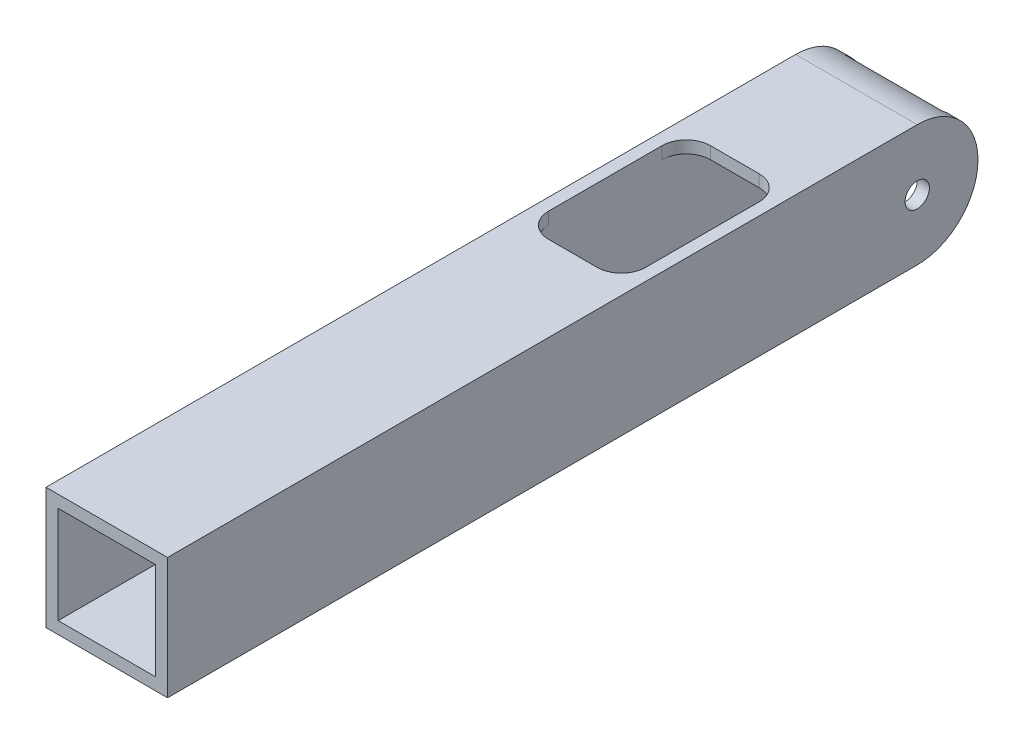
ISO-10303-21;
HEADER;
FILE_DESCRIPTION(('STEP AP214'),'2;1');
FILE_NAME('part.step','',(''),(''),'','','');
FILE_SCHEMA(('AUTOMOTIVE_DESIGN { 1 0 10303 214 1 1 1 1 }'));
ENDSEC;
DATA;
#1=APPLICATION_CONTEXT('core data for automotive mechanical design processes');
#2=APPLICATION_PROTOCOL_DEFINITION('international standard','automotive_design',2000,#1);
#3=PRODUCT_CONTEXT('',#1,'mechanical');
#4=PRODUCT('Part','Part','',(#3));
#5=PRODUCT_RELATED_PRODUCT_CATEGORY('part','',(#4));
#6=PRODUCT_DEFINITION_FORMATION('','',#4);
#7=PRODUCT_DEFINITION_CONTEXT('part definition',#1,'design');
#8=PRODUCT_DEFINITION('design','',#6,#7);
#9=PRODUCT_DEFINITION_SHAPE('','',#8);
#10=(LENGTH_UNIT() NAMED_UNIT(*) SI_UNIT(.MILLI.,.METRE.));
#11=(NAMED_UNIT(*) PLANE_ANGLE_UNIT() SI_UNIT($,.RADIAN.));
#12=(NAMED_UNIT(*) SI_UNIT($,.STERADIAN.) SOLID_ANGLE_UNIT());
#13=UNCERTAINTY_MEASURE_WITH_UNIT(LENGTH_MEASURE(1.E-05),#10,'distance_accuracy_value','');
#14=(GEOMETRIC_REPRESENTATION_CONTEXT(3) GLOBAL_UNCERTAINTY_ASSIGNED_CONTEXT((#13)) GLOBAL_UNIT_ASSIGNED_CONTEXT((#10,
#11,#12)) REPRESENTATION_CONTEXT('',''));
#15=CARTESIAN_POINT('',(0.,0.,0.));
#16=DIRECTION('',(0.,0.,1.));
#17=DIRECTION('',(1.,0.,0.));
#18=AXIS2_PLACEMENT_3D('',#15,#16,#17);
#19=CARTESIAN_POINT('',(-6.,6.00000000000001,0.));
#20=DIRECTION('',(0.,1.,0.));
#21=DIRECTION('',(0.,0.,1.));
#22=AXIS2_PLACEMENT_3D('',#19,#20,#21);
#23=PLANE('',#22);
#24=DIRECTION('',(0.,0.,1.));
#25=VECTOR('',#24,1.);
#26=CARTESIAN_POINT('',(6.,6.00000000000001,0.));
#27=LINE('',#26,#25);
#28=CARTESIAN_POINT('',(6.,6.00000000000001,3.00000000000001));
#29=VERTEX_POINT('',#28);
#30=CARTESIAN_POINT('',(6.,6.00000000000001,25.5));
#31=VERTEX_POINT('',#30);
#32=EDGE_CURVE('E167',#29,#31,#27,.T.);
#33=ORIENTED_EDGE('',*,*,#32,.T.);
#34=CARTESIAN_POINT('',(3.,6.00000000000001,25.5));
#35=DIRECTION('',(0.,1.,0.));
#36=DIRECTION('',(0.,0.,1.));
#37=AXIS2_PLACEMENT_3D('',#34,#35,#36);
#38=CIRCLE('',#37,3.);
#39=CARTESIAN_POINT('',(3.,6.00000000000001,22.5));
#40=VERTEX_POINT('',#39);
#41=EDGE_CURVE('E276',#31,#40,#38,.T.);
#42=ORIENTED_EDGE('',*,*,#41,.T.);
#43=DIRECTION('',(-1.,0.,0.));
#44=VECTOR('',#43,1.);
#45=CARTESIAN_POINT('',(-6.,6.00000000000001,22.5));
#46=LINE('',#45,#44);
#47=CARTESIAN_POINT('',(-3.,6.00000000000001,22.5));
#48=VERTEX_POINT('',#47);
#49=EDGE_CURVE('E252',#40,#48,#46,.T.);
#50=ORIENTED_EDGE('',*,*,#49,.T.);
#51=CARTESIAN_POINT('',(-3.,6.00000000000001,25.5));
#52=DIRECTION('',(0.,1.,0.));
#53=DIRECTION('',(0.,0.,1.));
#54=AXIS2_PLACEMENT_3D('',#51,#52,#53);
#55=CIRCLE('',#54,3.);
#56=CARTESIAN_POINT('',(-6.,6.00000000000001,25.5));
#57=VERTEX_POINT('',#56);
#58=EDGE_CURVE('E280',#48,#57,#55,.T.);
#59=ORIENTED_EDGE('',*,*,#58,.T.);
#60=DIRECTION('',(0.,0.,1.));
#61=VECTOR('',#60,1.);
#62=CARTESIAN_POINT('',(-6.,6.00000000000001,0.));
#63=LINE('',#62,#61);
#64=CARTESIAN_POINT('',(-6.,6.00000000000001,3.00000000000001));
#65=VERTEX_POINT('',#64);
#66=EDGE_CURVE('E166',#65,#57,#63,.T.);
#67=ORIENTED_EDGE('',*,*,#66,.F.);
#68=DIRECTION('',(1.,0.,0.));
#69=VECTOR('',#68,1.);
#70=CARTESIAN_POINT('',(-6.,6.00000000000001,3.00000000000001));
#71=LINE('',#70,#69);
#72=EDGE_CURVE('E237',#65,#29,#71,.T.);
#73=ORIENTED_EDGE('',*,*,#72,.T.);
#74=EDGE_LOOP('',(#33,#42,#50,#59,#67,#73));
#75=FACE_BOUND('',#74,.T.);
#76=ADVANCED_FACE('F31',(#75),#23,.F.);
#77=CARTESIAN_POINT('',(7.5,-7.49999999999999,100.));
#78=DIRECTION('',(-1.,0.,0.));
#79=DIRECTION('',(0.,0.,1.));
#80=AXIS2_PLACEMENT_3D('',#77,#78,#79);
#81=PLANE('',#80);
#82=CARTESIAN_POINT('',(7.5,0.,7.50000000000001));
#83=DIRECTION('',(1.,0.,0.));
#84=DIRECTION('',(0.,0.,-1.));
#85=AXIS2_PLACEMENT_3D('',#82,#83,#84);
#86=CIRCLE('',#85,1.5);
#87=CARTESIAN_POINT('',(7.5,0.,6.00000000000001));
#88=VERTEX_POINT('',#87);
#89=EDGE_CURVE('E313',#88,#88,#86,.T.);
#90=ORIENTED_EDGE('',*,*,#89,.F.);
#91=EDGE_LOOP('',(#90));
#92=FACE_BOUND('',#91,.T.);
#93=DIRECTION('',(0.,0.,-1.));
#94=VECTOR('',#93,1.);
#95=CARTESIAN_POINT('',(7.5,-7.49999999999999,100.));
#96=LINE('',#95,#94);
#97=CARTESIAN_POINT('',(7.5,-7.49999999999999,100.));
#98=VERTEX_POINT('',#97);
#99=CARTESIAN_POINT('',(7.5,-7.49999999999999,7.50000000000001));
#100=VERTEX_POINT('',#99);
#101=EDGE_CURVE('E201',#98,#100,#96,.T.);
#102=ORIENTED_EDGE('',*,*,#101,.T.);
#103=CARTESIAN_POINT('',(7.5,0.,7.50000000000001));
#104=DIRECTION('',(-1.,0.,0.));
#105=DIRECTION('',(0.,0.,1.));
#106=AXIS2_PLACEMENT_3D('',#103,#104,#105);
#107=CIRCLE('',#106,7.5);
#108=CARTESIAN_POINT('',(7.5,0.,0.));
#109=VERTEX_POINT('',#108);
#110=EDGE_CURVE('E218',#100,#109,#107,.F.);
#111=ORIENTED_EDGE('',*,*,#110,.T.);
#112=CARTESIAN_POINT('',(7.5,0.,7.50000000000001));
#113=DIRECTION('',(-1.,0.,0.));
#114=DIRECTION('',(0.,0.,1.));
#115=AXIS2_PLACEMENT_3D('',#112,#113,#114);
#116=CIRCLE('',#115,7.5);
#117=CARTESIAN_POINT('',(7.5,7.50000000000001,7.50000000000001));
#118=VERTEX_POINT('',#117);
#119=EDGE_CURVE('E216',#109,#118,#116,.F.);
#120=ORIENTED_EDGE('',*,*,#119,.T.);
#121=DIRECTION('',(0.,0.,-1.));
#122=VECTOR('',#121,1.);
#123=CARTESIAN_POINT('',(7.5,7.50000000000001,100.));
#124=LINE('',#123,#122);
#125=CARTESIAN_POINT('',(7.5,7.50000000000001,100.));
#126=VERTEX_POINT('',#125);
#127=EDGE_CURVE('E210',#126,#118,#124,.T.);
#128=ORIENTED_EDGE('',*,*,#127,.F.);
#129=DIRECTION('',(0.,1.,0.));
#130=VECTOR('',#129,1.);
#131=CARTESIAN_POINT('',(7.5,-7.49999999999999,100.));
#132=LINE('',#131,#130);
#133=EDGE_CURVE('E189',#98,#126,#132,.T.);
#134=ORIENTED_EDGE('',*,*,#133,.F.);
#135=EDGE_LOOP('',(#102,#111,#120,#128,#134));
#136=FACE_BOUND('',#135,.T.);
#137=ADVANCED_FACE('F362',(#92,#136),#81,.F.);
#138=CARTESIAN_POINT('',(-7.5,7.50000000000001,100.));
#139=DIRECTION('',(0.,-1.,0.));
#140=DIRECTION('',(0.,0.,-1.));
#141=AXIS2_PLACEMENT_3D('',#138,#139,#140);
#142=PLANE('',#141);
#143=DIRECTION('',(1.,0.,0.));
#144=VECTOR('',#143,1.);
#145=CARTESIAN_POINT('',(6.00000000000001,7.50000000000001,42.5));
#146=LINE('',#145,#144);
#147=CARTESIAN_POINT('',(-3.,7.50000000000001,42.5));
#148=VERTEX_POINT('',#147);
#149=CARTESIAN_POINT('',(3.,7.50000000000001,42.5));
#150=VERTEX_POINT('',#149);
#151=EDGE_CURVE('E292',#148,#150,#146,.T.);
#152=ORIENTED_EDGE('',*,*,#151,.F.);
#153=CARTESIAN_POINT('',(-3.,7.50000000000001,39.5));
#154=DIRECTION('',(0.,-1.,0.));
#155=DIRECTION('',(0.,0.,-1.));
#156=AXIS2_PLACEMENT_3D('',#153,#154,#155);
#157=CIRCLE('',#156,3.);
#158=CARTESIAN_POINT('',(-5.99999999999999,7.50000000000001,39.5));
#159=VERTEX_POINT('',#158);
#160=EDGE_CURVE('E39',#148,#159,#157,.T.);
#161=ORIENTED_EDGE('',*,*,#160,.T.);
#162=DIRECTION('',(0.,0.,1.));
#163=VECTOR('',#162,1.);
#164=CARTESIAN_POINT('',(-5.99999999999999,7.50000000000001,42.5));
#165=LINE('',#164,#163);
#166=CARTESIAN_POINT('',(-5.99999999999999,7.50000000000001,25.5));
#167=VERTEX_POINT('',#166);
#168=EDGE_CURVE('E291',#167,#159,#165,.T.);
#169=ORIENTED_EDGE('',*,*,#168,.F.);
#170=CARTESIAN_POINT('',(-3.,7.50000000000001,25.5));
#171=DIRECTION('',(0.,-1.,0.));
#172=DIRECTION('',(0.,0.,-1.));
#173=AXIS2_PLACEMENT_3D('',#170,#171,#172);
#174=CIRCLE('',#173,3.);
#175=CARTESIAN_POINT('',(-3.00000000000001,7.50000000000001,22.5));
#176=VERTEX_POINT('',#175);
#177=EDGE_CURVE('E278',#167,#176,#174,.T.);
#178=ORIENTED_EDGE('',*,*,#177,.T.);
#179=DIRECTION('',(-1.,0.,0.));
#180=VECTOR('',#179,1.);
#181=CARTESIAN_POINT('',(6.00000000000001,7.50000000000001,22.5));
#182=LINE('',#181,#180);
#183=CARTESIAN_POINT('',(3.,7.50000000000001,22.5));
#184=VERTEX_POINT('',#183);
#185=EDGE_CURVE('E310',#184,#176,#182,.T.);
#186=ORIENTED_EDGE('',*,*,#185,.F.);
#187=CARTESIAN_POINT('',(3.,7.50000000000001,25.5));
#188=DIRECTION('',(0.,-1.,0.));
#189=DIRECTION('',(0.,0.,-1.));
#190=AXIS2_PLACEMENT_3D('',#187,#188,#189);
#191=CIRCLE('',#190,3.);
#192=CARTESIAN_POINT('',(6.00000000000001,7.50000000000001,25.5));
#193=VERTEX_POINT('',#192);
#194=EDGE_CURVE('E274',#184,#193,#191,.T.);
#195=ORIENTED_EDGE('',*,*,#194,.T.);
#196=DIRECTION('',(0.,0.,-1.));
#197=VECTOR('',#196,1.);
#198=CARTESIAN_POINT('',(6.00000000000001,7.50000000000001,42.5));
#199=LINE('',#198,#197);
#200=CARTESIAN_POINT('',(6.00000000000001,7.50000000000001,39.5));
#201=VERTEX_POINT('',#200);
#202=EDGE_CURVE('E307',#201,#193,#199,.T.);
#203=ORIENTED_EDGE('',*,*,#202,.F.);
#204=CARTESIAN_POINT('',(3.,7.50000000000001,39.5));
#205=DIRECTION('',(0.,-1.,0.));
#206=DIRECTION('',(0.,0.,-1.));
#207=AXIS2_PLACEMENT_3D('',#204,#205,#206);
#208=CIRCLE('',#207,3.);
#209=EDGE_CURVE('E283',#201,#150,#208,.T.);
#210=ORIENTED_EDGE('',*,*,#209,.T.);
#211=EDGE_LOOP('',(#152,#161,#169,#178,#186,#195,#203,#210));
#212=FACE_BOUND('',#211,.T.);
#213=ORIENTED_EDGE('',*,*,#127,.T.);
#214=DIRECTION('',(-1.,0.,0.));
#215=VECTOR('',#214,1.);
#216=CARTESIAN_POINT('',(-7.5,7.50000000000001,7.50000000000001));
#217=LINE('',#216,#215);
#218=CARTESIAN_POINT('',(-7.5,7.50000000000001,7.50000000000001));
#219=VERTEX_POINT('',#218);
#220=EDGE_CURVE('E235',#118,#219,#217,.T.);
#221=ORIENTED_EDGE('',*,*,#220,.T.);
#222=DIRECTION('',(0.,0.,-1.));
#223=VECTOR('',#222,1.);
#224=CARTESIAN_POINT('',(-7.5,7.50000000000001,100.));
#225=LINE('',#224,#223);
#226=CARTESIAN_POINT('',(-7.5,7.50000000000001,100.));
#227=VERTEX_POINT('',#226);
#228=EDGE_CURVE('E207',#227,#219,#225,.T.);
#229=ORIENTED_EDGE('',*,*,#228,.F.);
#230=DIRECTION('',(-1.,0.,0.));
#231=VECTOR('',#230,1.);
#232=CARTESIAN_POINT('',(-7.5,7.50000000000001,100.));
#233=LINE('',#232,#231);
#234=EDGE_CURVE('E195',#126,#227,#233,.T.);
#235=ORIENTED_EDGE('',*,*,#234,.F.);
#236=EDGE_LOOP('',(#213,#221,#229,#235));
#237=FACE_BOUND('',#236,.T.);
#238=ADVANCED_FACE('F289',(#212,#237),#142,.F.);
#239=CARTESIAN_POINT('',(-7.5,-7.49999999999999,100.));
#240=DIRECTION('',(1.,0.,0.));
#241=DIRECTION('',(0.,0.,-1.));
#242=AXIS2_PLACEMENT_3D('',#239,#240,#241);
#243=PLANE('',#242);
#244=CARTESIAN_POINT('',(-7.5,0.,7.50000000000001));
#245=DIRECTION('',(1.,0.,0.));
#246=DIRECTION('',(0.,0.,-1.));
#247=AXIS2_PLACEMENT_3D('',#244,#245,#246);
#248=CIRCLE('',#247,1.5);
#249=CARTESIAN_POINT('',(-7.5,0.,6.00000000000001));
#250=VERTEX_POINT('',#249);
#251=EDGE_CURVE('E250',#250,#250,#248,.T.);
#252=ORIENTED_EDGE('',*,*,#251,.T.);
#253=EDGE_LOOP('',(#252));
#254=FACE_BOUND('',#253,.T.);
#255=CARTESIAN_POINT('',(-7.5,0.,7.50000000000001));
#256=DIRECTION('',(1.,0.,0.));
#257=DIRECTION('',(0.,0.,-1.));
#258=AXIS2_PLACEMENT_3D('',#255,#256,#257);
#259=CIRCLE('',#258,7.5);
#260=CARTESIAN_POINT('',(-7.5,0.,0.));
#261=VERTEX_POINT('',#260);
#262=EDGE_CURVE('E231',#219,#261,#259,.F.);
#263=ORIENTED_EDGE('',*,*,#262,.T.);
#264=CARTESIAN_POINT('',(-7.5,0.,7.50000000000001));
#265=DIRECTION('',(1.,0.,0.));
#266=DIRECTION('',(0.,0.,-1.));
#267=AXIS2_PLACEMENT_3D('',#264,#265,#266);
#268=CIRCLE('',#267,7.5);
#269=CARTESIAN_POINT('',(-7.5,-7.49999999999999,7.50000000000001));
#270=VERTEX_POINT('',#269);
#271=EDGE_CURVE('E233',#261,#270,#268,.F.);
#272=ORIENTED_EDGE('',*,*,#271,.T.);
#273=DIRECTION('',(0.,0.,-1.));
#274=VECTOR('',#273,1.);
#275=CARTESIAN_POINT('',(-7.5,-7.49999999999999,100.));
#276=LINE('',#275,#274);
#277=CARTESIAN_POINT('',(-7.5,-7.49999999999999,100.));
#278=VERTEX_POINT('',#277);
#279=EDGE_CURVE('E204',#278,#270,#276,.T.);
#280=ORIENTED_EDGE('',*,*,#279,.F.);
#281=DIRECTION('',(0.,-1.,0.));
#282=VECTOR('',#281,1.);
#283=CARTESIAN_POINT('',(-7.5,-7.49999999999999,100.));
#284=LINE('',#283,#282);
#285=EDGE_CURVE('E197',#227,#278,#284,.T.);
#286=ORIENTED_EDGE('',*,*,#285,.F.);
#287=ORIENTED_EDGE('',*,*,#228,.T.);
#288=EDGE_LOOP('',(#263,#272,#280,#286,#287));
#289=FACE_BOUND('',#288,.T.);
#290=ADVANCED_FACE('F367',(#254,#289),#243,.F.);
#291=CARTESIAN_POINT('',(-7.5,-7.49999999999999,100.));
#292=DIRECTION('',(0.,1.,0.));
#293=DIRECTION('',(0.,0.,1.));
#294=AXIS2_PLACEMENT_3D('',#291,#292,#293);
#295=PLANE('',#294);
#296=ORIENTED_EDGE('',*,*,#279,.T.);
#297=DIRECTION('',(1.,0.,0.));
#298=VECTOR('',#297,1.);
#299=CARTESIAN_POINT('',(7.5,-7.49999999999999,7.50000000000001));
#300=LINE('',#299,#298);
#301=EDGE_CURVE('E213',#270,#100,#300,.T.);
#302=ORIENTED_EDGE('',*,*,#301,.T.);
#303=ORIENTED_EDGE('',*,*,#101,.F.);
#304=DIRECTION('',(1.,0.,0.));
#305=VECTOR('',#304,1.);
#306=CARTESIAN_POINT('',(-7.5,-7.49999999999999,100.));
#307=LINE('',#306,#305);
#308=EDGE_CURVE('E199',#278,#98,#307,.T.);
#309=ORIENTED_EDGE('',*,*,#308,.F.);
#310=EDGE_LOOP('',(#296,#302,#303,#309));
#311=FACE_BOUND('',#310,.T.);
#312=ADVANCED_FACE('F358',(#311),#295,.F.);
#313=CARTESIAN_POINT('',(7.5,7.50000000000001,100.));
#314=DIRECTION('',(0.,0.,-1.));
#315=DIRECTION('',(-1.,0.,0.));
#316=AXIS2_PLACEMENT_3D('',#313,#314,#315);
#317=PLANE('',#316);
#318=DIRECTION('',(-1.,0.,0.));
#319=VECTOR('',#318,1.);
#320=CARTESIAN_POINT('',(-6.,6.00000000000001,100.));
#321=LINE('',#320,#319);
#322=CARTESIAN_POINT('',(6.,6.00000000000001,100.));
#323=VERTEX_POINT('',#322);
#324=CARTESIAN_POINT('',(-6.,6.00000000000001,100.));
#325=VERTEX_POINT('',#324);
#326=EDGE_CURVE('E170',#323,#325,#321,.T.);
#327=ORIENTED_EDGE('',*,*,#326,.F.);
#328=DIRECTION('',(0.,1.,0.));
#329=VECTOR('',#328,1.);
#330=CARTESIAN_POINT('',(6.,-6.00000000000001,100.));
#331=LINE('',#330,#329);
#332=CARTESIAN_POINT('',(6.,-6.00000000000001,100.));
#333=VERTEX_POINT('',#332);
#334=EDGE_CURVE('E177',#333,#323,#331,.T.);
#335=ORIENTED_EDGE('',*,*,#334,.F.);
#336=DIRECTION('',(1.,0.,0.));
#337=VECTOR('',#336,1.);
#338=CARTESIAN_POINT('',(-6.,-6.00000000000001,100.));
#339=LINE('',#338,#337);
#340=CARTESIAN_POINT('',(-6.,-6.00000000000001,100.));
#341=VERTEX_POINT('',#340);
#342=EDGE_CURVE('E182',#341,#333,#339,.T.);
#343=ORIENTED_EDGE('',*,*,#342,.F.);
#344=DIRECTION('',(0.,-1.,0.));
#345=VECTOR('',#344,1.);
#346=CARTESIAN_POINT('',(-6.,-6.00000000000001,100.));
#347=LINE('',#346,#345);
#348=EDGE_CURVE('E161',#325,#341,#347,.T.);
#349=ORIENTED_EDGE('',*,*,#348,.F.);
#350=EDGE_LOOP('',(#327,#335,#343,#349));
#351=FACE_BOUND('',#350,.T.);
#352=ORIENTED_EDGE('',*,*,#133,.T.);
#353=ORIENTED_EDGE('',*,*,#234,.T.);
#354=ORIENTED_EDGE('',*,*,#285,.T.);
#355=ORIENTED_EDGE('',*,*,#308,.T.);
#356=EDGE_LOOP('',(#352,#353,#354,#355));
#357=FACE_BOUND('',#356,.T.);
#358=ADVANCED_FACE('F179',(#351,#357),#317,.F.);
#359=CARTESIAN_POINT('',(6.,-6.00000000000001,0.));
#360=DIRECTION('',(1.,0.,0.));
#361=DIRECTION('',(0.,0.,-1.));
#362=AXIS2_PLACEMENT_3D('',#359,#360,#361);
#363=PLANE('',#362);
#364=ORIENTED_EDGE('',*,*,#202,.T.);
#365=DIRECTION('',(0.,1.,0.));
#366=VECTOR('',#365,1.);
#367=CARTESIAN_POINT('',(6.,6.00000000000001,25.5));
#368=LINE('',#367,#366);
#369=EDGE_CURVE('E263',#193,#31,#368,.F.);
#370=ORIENTED_EDGE('',*,*,#369,.T.);
#371=ORIENTED_EDGE('',*,*,#32,.F.);
#372=CARTESIAN_POINT('',(6.,0.,7.50000000000001));
#373=DIRECTION('',(1.,0.,0.));
#374=DIRECTION('',(0.,0.,-1.));
#375=AXIS2_PLACEMENT_3D('',#372,#373,#374);
#376=CIRCLE('',#375,7.5);
#377=CARTESIAN_POINT('',(6.,0.,0.));
#378=VERTEX_POINT('',#377);
#379=EDGE_CURVE('E220',#29,#378,#376,.F.);
#380=ORIENTED_EDGE('',*,*,#379,.T.);
#381=CARTESIAN_POINT('',(6.,0.,7.50000000000001));
#382=DIRECTION('',(1.,0.,0.));
#383=DIRECTION('',(0.,0.,-1.));
#384=AXIS2_PLACEMENT_3D('',#381,#382,#383);
#385=CIRCLE('',#384,7.5);
#386=CARTESIAN_POINT('',(6.,-6.00000000000001,3.00000000000002));
#387=VERTEX_POINT('',#386);
#388=EDGE_CURVE('E222',#378,#387,#385,.F.);
#389=ORIENTED_EDGE('',*,*,#388,.T.);
#390=DIRECTION('',(0.,0.,1.));
#391=VECTOR('',#390,1.);
#392=CARTESIAN_POINT('',(6.,-6.00000000000001,0.));
#393=LINE('',#392,#391);
#394=EDGE_CURVE('E187',#387,#333,#393,.T.);
#395=ORIENTED_EDGE('',*,*,#394,.T.);
#396=ORIENTED_EDGE('',*,*,#334,.T.);
#397=CARTESIAN_POINT('',(6.,6.00000000000001,39.5));
#398=VERTEX_POINT('',#397);
#399=EDGE_CURVE('E173',#398,#323,#27,.T.);
#400=ORIENTED_EDGE('',*,*,#399,.F.);
#401=DIRECTION('',(0.,1.,0.));
#402=VECTOR('',#401,1.);
#403=CARTESIAN_POINT('',(6.,7.50000000000001,39.5));
#404=LINE('',#403,#402);
#405=EDGE_CURVE('E260',#398,#201,#404,.T.);
#406=ORIENTED_EDGE('',*,*,#405,.T.);
#407=EDGE_LOOP('',(#364,#370,#371,#380,#389,#395,#396,#400,#406));
#408=FACE_BOUND('',#407,.T.);
#409=CARTESIAN_POINT('',(6.,0.,7.50000000000001));
#410=DIRECTION('',(1.,0.,0.));
#411=DIRECTION('',(0.,0.,-1.));
#412=AXIS2_PLACEMENT_3D('',#409,#410,#411);
#413=CIRCLE('',#412,1.5);
#414=CARTESIAN_POINT('',(6.,0.,6.00000000000001));
#415=VERTEX_POINT('',#414);
#416=EDGE_CURVE('E244',#415,#415,#413,.T.);
#417=ORIENTED_EDGE('',*,*,#416,.T.);
#418=EDGE_LOOP('',(#417));
#419=FACE_BOUND('',#418,.T.);
#420=ADVANCED_FACE('F305',(#408,#419),#363,.F.);
#421=CARTESIAN_POINT('',(-6.,-6.00000000000001,0.));
#422=DIRECTION('',(0.,-1.,0.));
#423=DIRECTION('',(0.,0.,-1.));
#424=AXIS2_PLACEMENT_3D('',#421,#422,#423);
#425=PLANE('',#424);
#426=ORIENTED_EDGE('',*,*,#394,.F.);
#427=DIRECTION('',(-1.,0.,0.));
#428=VECTOR('',#427,1.);
#429=CARTESIAN_POINT('',(6.,-6.00000000000001,3.00000000000002));
#430=LINE('',#429,#428);
#431=CARTESIAN_POINT('',(-6.,-6.,3.00000000000002));
#432=VERTEX_POINT('',#431);
#433=EDGE_CURVE('E225',#387,#432,#430,.T.);
#434=ORIENTED_EDGE('',*,*,#433,.T.);
#435=DIRECTION('',(0.,0.,1.));
#436=VECTOR('',#435,1.);
#437=CARTESIAN_POINT('',(-6.,-6.00000000000001,0.));
#438=LINE('',#437,#436);
#439=EDGE_CURVE('E190',#432,#341,#438,.T.);
#440=ORIENTED_EDGE('',*,*,#439,.T.);
#441=ORIENTED_EDGE('',*,*,#342,.T.);
#442=EDGE_LOOP('',(#426,#434,#440,#441));
#443=FACE_BOUND('',#442,.T.);
#444=ADVANCED_FACE('F325',(#443),#425,.F.);
#445=CARTESIAN_POINT('',(-6.,-6.00000000000001,0.));
#446=DIRECTION('',(-1.,0.,0.));
#447=DIRECTION('',(0.,0.,1.));
#448=AXIS2_PLACEMENT_3D('',#445,#446,#447);
#449=PLANE('',#448);
#450=ORIENTED_EDGE('',*,*,#66,.T.);
#451=DIRECTION('',(0.,1.,0.));
#452=VECTOR('',#451,1.);
#453=CARTESIAN_POINT('',(-6.,7.50000000000001,25.5));
#454=LINE('',#453,#452);
#455=EDGE_CURVE('E267',#57,#167,#454,.T.);
#456=ORIENTED_EDGE('',*,*,#455,.T.);
#457=ORIENTED_EDGE('',*,*,#168,.T.);
#458=DIRECTION('',(0.,1.,0.));
#459=VECTOR('',#458,1.);
#460=CARTESIAN_POINT('',(-6.,6.00000000000001,39.5));
#461=LINE('',#460,#459);
#462=CARTESIAN_POINT('',(-6.,6.00000000000001,39.5));
#463=VERTEX_POINT('',#462);
#464=EDGE_CURVE('E165',#159,#463,#461,.F.);
#465=ORIENTED_EDGE('',*,*,#464,.T.);
#466=EDGE_CURVE('E155',#463,#325,#63,.T.);
#467=ORIENTED_EDGE('',*,*,#466,.T.);
#468=ORIENTED_EDGE('',*,*,#348,.T.);
#469=ORIENTED_EDGE('',*,*,#439,.F.);
#470=CARTESIAN_POINT('',(-6.,0.,7.50000000000001));
#471=DIRECTION('',(-1.,0.,0.));
#472=DIRECTION('',(0.,0.,1.));
#473=AXIS2_PLACEMENT_3D('',#470,#471,#472);
#474=CIRCLE('',#473,7.5);
#475=CARTESIAN_POINT('',(-6.,0.,0.));
#476=VERTEX_POINT('',#475);
#477=EDGE_CURVE('E229',#432,#476,#474,.F.);
#478=ORIENTED_EDGE('',*,*,#477,.T.);
#479=CARTESIAN_POINT('',(-6.,0.,7.50000000000001));
#480=DIRECTION('',(-1.,0.,0.));
#481=DIRECTION('',(0.,0.,1.));
#482=AXIS2_PLACEMENT_3D('',#479,#480,#481);
#483=CIRCLE('',#482,7.5);
#484=EDGE_CURVE('E227',#476,#65,#483,.F.);
#485=ORIENTED_EDGE('',*,*,#484,.T.);
#486=EDGE_LOOP('',(#450,#456,#457,#465,#467,#468,#469,#478,#485));
#487=FACE_BOUND('',#486,.T.);
#488=CARTESIAN_POINT('',(-6.,0.,7.50000000000001));
#489=DIRECTION('',(-1.,0.,0.));
#490=DIRECTION('',(0.,0.,1.));
#491=AXIS2_PLACEMENT_3D('',#488,#489,#490);
#492=CIRCLE('',#491,1.5);
#493=CARTESIAN_POINT('',(-6.,0.,9.00000000000001));
#494=VERTEX_POINT('',#493);
#495=EDGE_CURVE('E247',#494,#494,#492,.T.);
#496=ORIENTED_EDGE('',*,*,#495,.T.);
#497=EDGE_LOOP('',(#496));
#498=FACE_BOUND('',#497,.T.);
#499=ADVANCED_FACE('F157',(#487,#498),#449,.F.);
#500=ORIENTED_EDGE('',*,*,#466,.F.);
#501=CARTESIAN_POINT('',(-3.,6.00000000000001,39.5));
#502=DIRECTION('',(0.,1.,0.));
#503=DIRECTION('',(0.,0.,1.));
#504=AXIS2_PLACEMENT_3D('',#501,#502,#503);
#505=CIRCLE('',#504,3.);
#506=CARTESIAN_POINT('',(-3.,6.00000000000001,42.5));
#507=VERTEX_POINT('',#506);
#508=EDGE_CURVE('E11',#463,#507,#505,.T.);
#509=ORIENTED_EDGE('',*,*,#508,.T.);
#510=DIRECTION('',(1.,0.,0.));
#511=VECTOR('',#510,1.);
#512=CARTESIAN_POINT('',(-6.,6.00000000000001,42.5));
#513=LINE('',#512,#511);
#514=CARTESIAN_POINT('',(3.,6.00000000000001,42.5));
#515=VERTEX_POINT('',#514);
#516=EDGE_CURVE('E239',#507,#515,#513,.T.);
#517=ORIENTED_EDGE('',*,*,#516,.T.);
#518=CARTESIAN_POINT('',(3.,6.00000000000001,39.5));
#519=DIRECTION('',(0.,1.,0.));
#520=DIRECTION('',(0.,0.,1.));
#521=AXIS2_PLACEMENT_3D('',#518,#519,#520);
#522=CIRCLE('',#521,3.);
#523=EDGE_CURVE('E285',#515,#398,#522,.T.);
#524=ORIENTED_EDGE('',*,*,#523,.T.);
#525=ORIENTED_EDGE('',*,*,#399,.T.);
#526=ORIENTED_EDGE('',*,*,#326,.T.);
#527=EDGE_LOOP('',(#500,#509,#517,#524,#525,#526));
#528=FACE_BOUND('',#527,.T.);
#529=ADVANCED_FACE('F171',(#528),#23,.F.);
#530=CARTESIAN_POINT('',(-7.5,0.,7.50000000000001));
#531=DIRECTION('',(1.,0.,0.));
#532=DIRECTION('',(0.,0.,-1.));
#533=AXIS2_PLACEMENT_3D('',#530,#531,#532);
#534=CYLINDRICAL_SURFACE('',#533,7.5);
#535=DIRECTION('',(-1.,0.,0.));
#536=VECTOR('',#535,1.);
#537=CARTESIAN_POINT('',(7.5,0.,0.));
#538=LINE('',#537,#536);
#539=EDGE_CURVE('E243',#378,#109,#538,.F.);
#540=ORIENTED_EDGE('',*,*,#539,.F.);
#541=ORIENTED_EDGE('',*,*,#379,.F.);
#542=ORIENTED_EDGE('',*,*,#72,.F.);
#543=ORIENTED_EDGE('',*,*,#484,.F.);
#544=DIRECTION('',(-1.,0.,0.));
#545=VECTOR('',#544,1.);
#546=CARTESIAN_POINT('',(7.5,0.,0.));
#547=LINE('',#546,#545);
#548=EDGE_CURVE('E240',#261,#476,#547,.F.);
#549=ORIENTED_EDGE('',*,*,#548,.F.);
#550=ORIENTED_EDGE('',*,*,#262,.F.);
#551=ORIENTED_EDGE('',*,*,#220,.F.);
#552=ORIENTED_EDGE('',*,*,#119,.F.);
#553=EDGE_LOOP('',(#540,#541,#542,#543,#549,#550,#551,#552));
#554=FACE_BOUND('',#553,.T.);
#555=ADVANCED_FACE('F336',(#554),#534,.T.);
#556=CARTESIAN_POINT('',(-7.5,0.,7.50000000000001));
#557=DIRECTION('',(-1.,0.,0.));
#558=DIRECTION('',(0.,0.,1.));
#559=AXIS2_PLACEMENT_3D('',#556,#557,#558);
#560=CYLINDRICAL_SURFACE('',#559,7.5);
#561=ORIENTED_EDGE('',*,*,#388,.F.);
#562=ORIENTED_EDGE('',*,*,#539,.T.);
#563=ORIENTED_EDGE('',*,*,#110,.F.);
#564=ORIENTED_EDGE('',*,*,#301,.F.);
#565=ORIENTED_EDGE('',*,*,#271,.F.);
#566=ORIENTED_EDGE('',*,*,#548,.T.);
#567=ORIENTED_EDGE('',*,*,#477,.F.);
#568=ORIENTED_EDGE('',*,*,#433,.F.);
#569=EDGE_LOOP('',(#561,#562,#563,#564,#565,#566,#567,#568));
#570=FACE_BOUND('',#569,.T.);
#571=ADVANCED_FACE('F329',(#570),#560,.T.);
#572=CARTESIAN_POINT('',(-7.5,0.,7.50000000000001));
#573=DIRECTION('',(1.,0.,0.));
#574=DIRECTION('',(0.,0.,-1.));
#575=AXIS2_PLACEMENT_3D('',#572,#573,#574);
#576=CYLINDRICAL_SURFACE('',#575,1.5);
#577=ORIENTED_EDGE('',*,*,#251,.F.);
#578=EDGE_LOOP('',(#577));
#579=FACE_BOUND('',#578,.T.);
#580=ORIENTED_EDGE('',*,*,#495,.F.);
#581=EDGE_LOOP('',(#580));
#582=FACE_BOUND('',#581,.T.);
#583=ADVANCED_FACE('F398',(#579,#582),#576,.F.);
#584=ORIENTED_EDGE('',*,*,#89,.T.);
#585=EDGE_LOOP('',(#584));
#586=FACE_BOUND('',#585,.T.);
#587=ORIENTED_EDGE('',*,*,#416,.F.);
#588=EDGE_LOOP('',(#587));
#589=FACE_BOUND('',#588,.T.);
#590=ADVANCED_FACE('F395',(#586,#589),#576,.F.);
#591=CARTESIAN_POINT('',(6.00000000000001,4.50000000000001,22.5));
#592=DIRECTION('',(0.,0.,-1.));
#593=DIRECTION('',(-1.,0.,0.));
#594=AXIS2_PLACEMENT_3D('',#591,#592,#593);
#595=PLANE('',#594);
#596=ORIENTED_EDGE('',*,*,#49,.F.);
#597=DIRECTION('',(0.,1.,0.));
#598=VECTOR('',#597,1.);
#599=CARTESIAN_POINT('',(3.,7.50000000000001,22.5));
#600=LINE('',#599,#598);
#601=EDGE_CURVE('E257',#40,#184,#600,.T.);
#602=ORIENTED_EDGE('',*,*,#601,.T.);
#603=ORIENTED_EDGE('',*,*,#185,.T.);
#604=DIRECTION('',(0.,1.,0.));
#605=VECTOR('',#604,1.);
#606=CARTESIAN_POINT('',(-3.,6.00000000000001,22.5));
#607=LINE('',#606,#605);
#608=EDGE_CURVE('E255',#176,#48,#607,.F.);
#609=ORIENTED_EDGE('',*,*,#608,.T.);
#610=EDGE_LOOP('',(#596,#602,#603,#609));
#611=FACE_BOUND('',#610,.T.);
#612=ADVANCED_FACE('F349',(#611),#595,.F.);
#613=CARTESIAN_POINT('',(6.00000000000001,4.50000000000001,42.5));
#614=DIRECTION('',(0.,0.,1.));
#615=DIRECTION('',(1.,0.,0.));
#616=AXIS2_PLACEMENT_3D('',#613,#614,#615);
#617=PLANE('',#616);
#618=ORIENTED_EDGE('',*,*,#151,.T.);
#619=DIRECTION('',(0.,1.,0.));
#620=VECTOR('',#619,1.);
#621=CARTESIAN_POINT('',(3.,6.00000000000001,42.5));
#622=LINE('',#621,#620);
#623=EDGE_CURVE('E46',#150,#515,#622,.F.);
#624=ORIENTED_EDGE('',*,*,#623,.T.);
#625=ORIENTED_EDGE('',*,*,#516,.F.);
#626=DIRECTION('',(0.,1.,0.));
#627=VECTOR('',#626,1.);
#628=CARTESIAN_POINT('',(-3.,7.50000000000001,42.5));
#629=LINE('',#628,#627);
#630=EDGE_CURVE('E270',#507,#148,#629,.T.);
#631=ORIENTED_EDGE('',*,*,#630,.T.);
#632=EDGE_LOOP('',(#618,#624,#625,#631));
#633=FACE_BOUND('',#632,.T.);
#634=ADVANCED_FACE('F297',(#633),#617,.F.);
#635=CARTESIAN_POINT('',(3.,4.50000000000001,25.5));
#636=DIRECTION('',(0.,-1.,0.));
#637=DIRECTION('',(0.,0.,-1.));
#638=AXIS2_PLACEMENT_3D('',#635,#636,#637);
#639=CYLINDRICAL_SURFACE('',#638,3.);
#640=ORIENTED_EDGE('',*,*,#41,.F.);
#641=ORIENTED_EDGE('',*,*,#369,.F.);
#642=ORIENTED_EDGE('',*,*,#194,.F.);
#643=ORIENTED_EDGE('',*,*,#601,.F.);
#644=EDGE_LOOP('',(#640,#641,#642,#643));
#645=FACE_BOUND('',#644,.T.);
#646=ADVANCED_FACE('F353',(#645),#639,.F.);
#647=CARTESIAN_POINT('',(-3.,-6.00000000000001,25.5));
#648=DIRECTION('',(0.,-1.,0.));
#649=DIRECTION('',(0.,0.,-1.));
#650=AXIS2_PLACEMENT_3D('',#647,#648,#649);
#651=CYLINDRICAL_SURFACE('',#650,3.);
#652=ORIENTED_EDGE('',*,*,#58,.F.);
#653=ORIENTED_EDGE('',*,*,#608,.F.);
#654=ORIENTED_EDGE('',*,*,#177,.F.);
#655=ORIENTED_EDGE('',*,*,#455,.F.);
#656=EDGE_LOOP('',(#652,#653,#654,#655));
#657=FACE_BOUND('',#656,.T.);
#658=ADVANCED_FACE('F347',(#657),#651,.F.);
#659=CARTESIAN_POINT('',(3.,-6.00000000000001,39.5));
#660=DIRECTION('',(0.,-1.,0.));
#661=DIRECTION('',(0.,0.,-1.));
#662=AXIS2_PLACEMENT_3D('',#659,#660,#661);
#663=CYLINDRICAL_SURFACE('',#662,3.);
#664=ORIENTED_EDGE('',*,*,#523,.F.);
#665=ORIENTED_EDGE('',*,*,#623,.F.);
#666=ORIENTED_EDGE('',*,*,#209,.F.);
#667=ORIENTED_EDGE('',*,*,#405,.F.);
#668=EDGE_LOOP('',(#664,#665,#666,#667));
#669=FACE_BOUND('',#668,.T.);
#670=ADVANCED_FACE('F301',(#669),#663,.F.);
#671=CARTESIAN_POINT('',(-3.,4.50000000000001,39.5));
#672=DIRECTION('',(0.,-1.,0.));
#673=DIRECTION('',(0.,0.,-1.));
#674=AXIS2_PLACEMENT_3D('',#671,#672,#673);
#675=CYLINDRICAL_SURFACE('',#674,3.);
#676=ORIENTED_EDGE('',*,*,#508,.F.);
#677=ORIENTED_EDGE('',*,*,#464,.F.);
#678=ORIENTED_EDGE('',*,*,#160,.F.);
#679=ORIENTED_EDGE('',*,*,#630,.F.);
#680=EDGE_LOOP('',(#676,#677,#678,#679));
#681=FACE_BOUND('',#680,.T.);
#682=ADVANCED_FACE('F33',(#681),#675,.F.);
#683=CLOSED_SHELL('',(#76,#137,#238,#290,#312,#358,#420,#444,#499,#529,#555,#571,#583,#590,#612,
#634,#646,#658,#670,#682));
#684=MANIFOLD_SOLID_BREP('B2',#683);
#685=ADVANCED_BREP_SHAPE_REPRESENTATION('',(#18,#684),#14);
#686=SHAPE_DEFINITION_REPRESENTATION(#9,#685);
ENDSEC;
END-ISO-10303-21;
